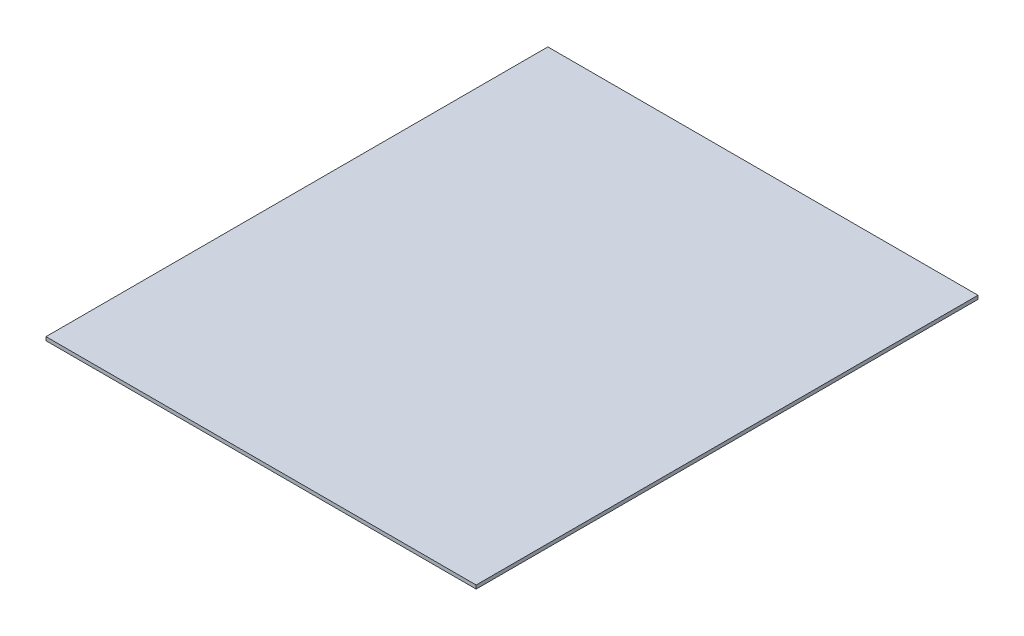
ISO-10303-21;
HEADER;
FILE_DESCRIPTION(('STEP AP214'),'2;1');
FILE_NAME('part.step','',(''),(''),'','','');
FILE_SCHEMA(('AUTOMOTIVE_DESIGN { 1 0 10303 214 1 1 1 1 }'));
ENDSEC;
DATA;
#1=APPLICATION_CONTEXT('core data for automotive mechanical design processes');
#2=APPLICATION_PROTOCOL_DEFINITION('international standard','automotive_design',2000,#1);
#3=PRODUCT_CONTEXT('',#1,'mechanical');
#4=PRODUCT('Part','Part','',(#3));
#5=PRODUCT_RELATED_PRODUCT_CATEGORY('part','',(#4));
#6=PRODUCT_DEFINITION_FORMATION('','',#4);
#7=PRODUCT_DEFINITION_CONTEXT('part definition',#1,'design');
#8=PRODUCT_DEFINITION('design','',#6,#7);
#9=PRODUCT_DEFINITION_SHAPE('','',#8);
#10=(LENGTH_UNIT() NAMED_UNIT(*) SI_UNIT(.MILLI.,.METRE.));
#11=(NAMED_UNIT(*) PLANE_ANGLE_UNIT() SI_UNIT($,.RADIAN.));
#12=(NAMED_UNIT(*) SI_UNIT($,.STERADIAN.) SOLID_ANGLE_UNIT());
#13=UNCERTAINTY_MEASURE_WITH_UNIT(LENGTH_MEASURE(1.E-05),#10,'distance_accuracy_value','');
#14=(GEOMETRIC_REPRESENTATION_CONTEXT(3) GLOBAL_UNCERTAINTY_ASSIGNED_CONTEXT((#13)) GLOBAL_UNIT_ASSIGNED_CONTEXT((#10,
#11,#12)) REPRESENTATION_CONTEXT('',''));
#15=CARTESIAN_POINT('',(0.,0.,0.));
#16=DIRECTION('',(0.,0.,1.));
#17=DIRECTION('',(1.,0.,0.));
#18=AXIS2_PLACEMENT_3D('',#15,#16,#17);
#19=CARTESIAN_POINT('',(0.,2.,0.));
#20=DIRECTION('',(1.,0.,0.));
#21=DIRECTION('',(0.,0.,-1.));
#22=AXIS2_PLACEMENT_3D('',#19,#20,#21);
#23=PLANE('',#22);
#24=DIRECTION('',(0.,0.,1.));
#25=VECTOR('',#24,1.);
#26=CARTESIAN_POINT('',(0.,0.,0.));
#27=LINE('',#26,#25);
#28=CARTESIAN_POINT('',(0.,0.,-280.));
#29=VERTEX_POINT('',#28);
#30=CARTESIAN_POINT('',(0.,0.,0.));
#31=VERTEX_POINT('',#30);
#32=EDGE_CURVE('E107',#29,#31,#27,.T.);
#33=ORIENTED_EDGE('',*,*,#32,.T.);
#34=DIRECTION('',(0.,-1.,0.));
#35=VECTOR('',#34,1.);
#36=CARTESIAN_POINT('',(0.,2.,0.));
#37=LINE('',#36,#35);
#38=CARTESIAN_POINT('',(0.,2.,0.));
#39=VERTEX_POINT('',#38);
#40=EDGE_CURVE('E11',#39,#31,#37,.T.);
#41=ORIENTED_EDGE('',*,*,#40,.F.);
#42=DIRECTION('',(0.,0.,1.));
#43=VECTOR('',#42,1.);
#44=CARTESIAN_POINT('',(0.,2.,0.));
#45=LINE('',#44,#43);
#46=CARTESIAN_POINT('',(0.,2.,-280.));
#47=VERTEX_POINT('',#46);
#48=EDGE_CURVE('E91',#47,#39,#45,.T.);
#49=ORIENTED_EDGE('',*,*,#48,.F.);
#50=DIRECTION('',(0.,-1.,0.));
#51=VECTOR('',#50,1.);
#52=CARTESIAN_POINT('',(0.,2.,-280.));
#53=LINE('',#52,#51);
#54=EDGE_CURVE('E103',#47,#29,#53,.T.);
#55=ORIENTED_EDGE('',*,*,#54,.T.);
#56=EDGE_LOOP('',(#33,#41,#49,#55));
#57=FACE_BOUND('',#56,.T.);
#58=ADVANCED_FACE('F39',(#57),#23,.F.);
#59=CARTESIAN_POINT('',(0.,2.,0.));
#60=DIRECTION('',(0.,0.,-1.));
#61=DIRECTION('',(-1.,0.,0.));
#62=AXIS2_PLACEMENT_3D('',#59,#60,#61);
#63=PLANE('',#62);
#64=DIRECTION('',(1.,0.,0.));
#65=VECTOR('',#64,1.);
#66=CARTESIAN_POINT('',(0.,0.,0.));
#67=LINE('',#66,#65);
#68=CARTESIAN_POINT('',(240.,0.,0.));
#69=VERTEX_POINT('',#68);
#70=EDGE_CURVE('E96',#31,#69,#67,.T.);
#71=ORIENTED_EDGE('',*,*,#70,.T.);
#72=DIRECTION('',(0.,-1.,0.));
#73=VECTOR('',#72,1.);
#74=CARTESIAN_POINT('',(240.,2.,0.));
#75=LINE('',#74,#73);
#76=CARTESIAN_POINT('',(240.,2.,0.));
#77=VERTEX_POINT('',#76);
#78=EDGE_CURVE('E48',#77,#69,#75,.T.);
#79=ORIENTED_EDGE('',*,*,#78,.F.);
#80=DIRECTION('',(1.,0.,0.));
#81=VECTOR('',#80,1.);
#82=CARTESIAN_POINT('',(0.,2.,0.));
#83=LINE('',#82,#81);
#84=EDGE_CURVE('E86',#39,#77,#83,.T.);
#85=ORIENTED_EDGE('',*,*,#84,.F.);
#86=ORIENTED_EDGE('',*,*,#40,.T.);
#87=EDGE_LOOP('',(#71,#79,#85,#86));
#88=FACE_BOUND('',#87,.T.);
#89=ADVANCED_FACE('F95',(#88),#63,.F.);
#90=CARTESIAN_POINT('',(240.,2.,0.));
#91=DIRECTION('',(-1.,0.,0.));
#92=DIRECTION('',(0.,0.,1.));
#93=AXIS2_PLACEMENT_3D('',#90,#91,#92);
#94=PLANE('',#93);
#95=DIRECTION('',(0.,0.,-1.));
#96=VECTOR('',#95,1.);
#97=CARTESIAN_POINT('',(240.,0.,0.));
#98=LINE('',#97,#96);
#99=CARTESIAN_POINT('',(240.,0.,-280.));
#100=VERTEX_POINT('',#99);
#101=EDGE_CURVE('E73',#69,#100,#98,.T.);
#102=ORIENTED_EDGE('',*,*,#101,.T.);
#103=DIRECTION('',(0.,-1.,0.));
#104=VECTOR('',#103,1.);
#105=CARTESIAN_POINT('',(240.,2.,-280.));
#106=LINE('',#105,#104);
#107=CARTESIAN_POINT('',(240.,2.,-280.));
#108=VERTEX_POINT('',#107);
#109=EDGE_CURVE('E98',#108,#100,#106,.T.);
#110=ORIENTED_EDGE('',*,*,#109,.F.);
#111=DIRECTION('',(0.,0.,-1.));
#112=VECTOR('',#111,1.);
#113=CARTESIAN_POINT('',(240.,2.,0.));
#114=LINE('',#113,#112);
#115=EDGE_CURVE('E89',#77,#108,#114,.T.);
#116=ORIENTED_EDGE('',*,*,#115,.F.);
#117=ORIENTED_EDGE('',*,*,#78,.T.);
#118=EDGE_LOOP('',(#102,#110,#116,#117));
#119=FACE_BOUND('',#118,.T.);
#120=ADVANCED_FACE('F99',(#119),#94,.F.);
#121=CARTESIAN_POINT('',(0.,2.,-280.));
#122=DIRECTION('',(0.,0.,1.));
#123=DIRECTION('',(1.,0.,0.));
#124=AXIS2_PLACEMENT_3D('',#121,#122,#123);
#125=PLANE('',#124);
#126=DIRECTION('',(-1.,0.,0.));
#127=VECTOR('',#126,1.);
#128=CARTESIAN_POINT('',(0.,0.,-280.));
#129=LINE('',#128,#127);
#130=EDGE_CURVE('E79',#100,#29,#129,.T.);
#131=ORIENTED_EDGE('',*,*,#130,.T.);
#132=ORIENTED_EDGE('',*,*,#54,.F.);
#133=DIRECTION('',(-1.,0.,0.));
#134=VECTOR('',#133,1.);
#135=CARTESIAN_POINT('',(0.,2.,-280.));
#136=LINE('',#135,#134);
#137=EDGE_CURVE('E56',#108,#47,#136,.T.);
#138=ORIENTED_EDGE('',*,*,#137,.F.);
#139=ORIENTED_EDGE('',*,*,#109,.T.);
#140=EDGE_LOOP('',(#131,#132,#138,#139));
#141=FACE_BOUND('',#140,.T.);
#142=ADVANCED_FACE('F120',(#141),#125,.F.);
#143=CARTESIAN_POINT('',(0.,2.,0.));
#144=DIRECTION('',(0.,-1.,0.));
#145=DIRECTION('',(0.,0.,-1.));
#146=AXIS2_PLACEMENT_3D('',#143,#144,#145);
#147=PLANE('',#146);
#148=ORIENTED_EDGE('',*,*,#48,.T.);
#149=ORIENTED_EDGE('',*,*,#84,.T.);
#150=ORIENTED_EDGE('',*,*,#115,.T.);
#151=ORIENTED_EDGE('',*,*,#137,.T.);
#152=EDGE_LOOP('',(#148,#149,#150,#151));
#153=FACE_BOUND('',#152,.T.);
#154=ADVANCED_FACE('F87',(#153),#147,.F.);
#155=CARTESIAN_POINT('',(0.,0.,0.));
#156=DIRECTION('',(0.,-1.,0.));
#157=DIRECTION('',(0.,0.,-1.));
#158=AXIS2_PLACEMENT_3D('',#155,#156,#157);
#159=PLANE('',#158);
#160=ORIENTED_EDGE('',*,*,#32,.F.);
#161=ORIENTED_EDGE('',*,*,#130,.F.);
#162=ORIENTED_EDGE('',*,*,#101,.F.);
#163=ORIENTED_EDGE('',*,*,#70,.F.);
#164=EDGE_LOOP('',(#160,#161,#162,#163));
#165=FACE_BOUND('',#164,.T.);
#166=ADVANCED_FACE('F123',(#165),#159,.T.);
#167=CLOSED_SHELL('',(#58,#89,#120,#142,#154,#166));
#168=MANIFOLD_SOLID_BREP('B2',#167);
#169=ADVANCED_BREP_SHAPE_REPRESENTATION('',(#18,#168),#14);
#170=SHAPE_DEFINITION_REPRESENTATION(#9,#169);
ENDSEC;
END-ISO-10303-21;
